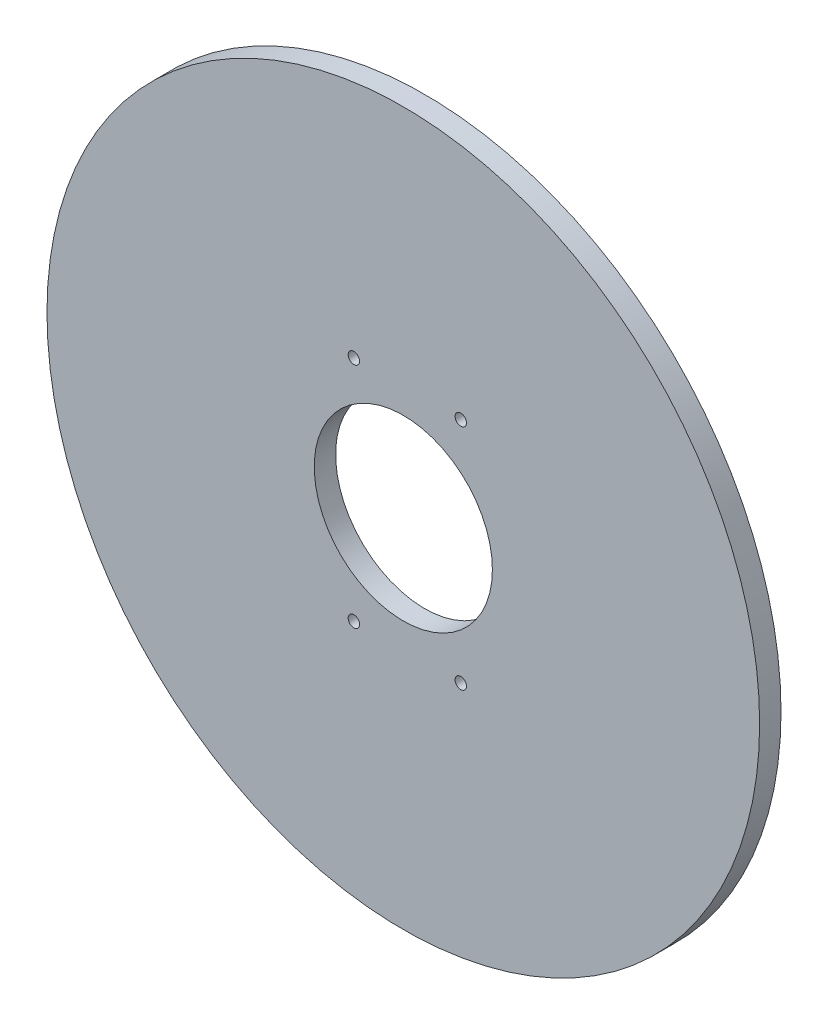
ISO-10303-21;
HEADER;
FILE_DESCRIPTION(('STEP AP214'),'2;1');
FILE_NAME('part.step','',(''),(''),'','','');
FILE_SCHEMA(('AUTOMOTIVE_DESIGN { 1 0 10303 214 1 1 1 1 }'));
ENDSEC;
DATA;
#1=APPLICATION_CONTEXT('core data for automotive mechanical design processes');
#2=APPLICATION_PROTOCOL_DEFINITION('international standard','automotive_design',2000,#1);
#3=PRODUCT_CONTEXT('',#1,'mechanical');
#4=PRODUCT('Part','Part','',(#3));
#5=PRODUCT_RELATED_PRODUCT_CATEGORY('part','',(#4));
#6=PRODUCT_DEFINITION_FORMATION('','',#4);
#7=PRODUCT_DEFINITION_CONTEXT('part definition',#1,'design');
#8=PRODUCT_DEFINITION('design','',#6,#7);
#9=PRODUCT_DEFINITION_SHAPE('','',#8);
#10=(LENGTH_UNIT() NAMED_UNIT(*) SI_UNIT(.MILLI.,.METRE.));
#11=(NAMED_UNIT(*) PLANE_ANGLE_UNIT() SI_UNIT($,.RADIAN.));
#12=(NAMED_UNIT(*) SI_UNIT($,.STERADIAN.) SOLID_ANGLE_UNIT());
#13=UNCERTAINTY_MEASURE_WITH_UNIT(LENGTH_MEASURE(1.E-05),#10,'distance_accuracy_value','');
#14=(GEOMETRIC_REPRESENTATION_CONTEXT(3) GLOBAL_UNCERTAINTY_ASSIGNED_CONTEXT((#13)) GLOBAL_UNIT_ASSIGNED_CONTEXT((#10,
#11,#12)) REPRESENTATION_CONTEXT('',''));
#15=CARTESIAN_POINT('',(0.,0.,0.));
#16=DIRECTION('',(0.,0.,1.));
#17=DIRECTION('',(1.,0.,0.));
#18=AXIS2_PLACEMENT_3D('',#15,#16,#17);
#19=CARTESIAN_POINT('',(0.,0.,6.));
#20=DIRECTION('',(0.,0.,1.));
#21=DIRECTION('',(1.,0.,0.));
#22=AXIS2_PLACEMENT_3D('',#19,#20,#21);
#23=PLANE('',#22);
#24=CARTESIAN_POINT('',(16.1297094664268,-32.,6.));
#25=DIRECTION('',(0.,0.,-1.));
#26=DIRECTION('',(1.,0.,0.));
#27=AXIS2_PLACEMENT_3D('',#24,#25,#26);
#28=CIRCLE('',#27,1.6);
#29=CARTESIAN_POINT('',(17.7297094664268,-32.,6.));
#30=VERTEX_POINT('',#29);
#31=EDGE_CURVE('E65',#30,#30,#28,.T.);
#32=ORIENTED_EDGE('',*,*,#31,.T.);
#33=EDGE_LOOP('',(#32));
#34=FACE_BOUND('',#33,.T.);
#35=CARTESIAN_POINT('',(-13.8702905335732,-32.,6.));
#36=DIRECTION('',(0.,0.,-1.));
#37=DIRECTION('',(1.,0.,0.));
#38=AXIS2_PLACEMENT_3D('',#35,#36,#37);
#39=CIRCLE('',#38,1.6);
#40=CARTESIAN_POINT('',(-12.2702905335732,-32.,6.));
#41=VERTEX_POINT('',#40);
#42=EDGE_CURVE('E59',#41,#41,#39,.T.);
#43=ORIENTED_EDGE('',*,*,#42,.T.);
#44=EDGE_LOOP('',(#43));
#45=FACE_BOUND('',#44,.T.);
#46=CARTESIAN_POINT('',(-13.8702905335732,32.,6.));
#47=DIRECTION('',(0.,0.,-1.));
#48=DIRECTION('',(-1.,0.,0.));
#49=AXIS2_PLACEMENT_3D('',#46,#47,#48);
#50=CIRCLE('',#49,1.6);
#51=CARTESIAN_POINT('',(-15.4702905335732,32.,6.));
#52=VERTEX_POINT('',#51);
#53=EDGE_CURVE('E53',#52,#52,#50,.T.);
#54=ORIENTED_EDGE('',*,*,#53,.T.);
#55=EDGE_LOOP('',(#54));
#56=FACE_BOUND('',#55,.T.);
#57=CARTESIAN_POINT('',(16.1297094664268,32.,6.));
#58=DIRECTION('',(0.,0.,-1.));
#59=DIRECTION('',(-1.,0.,0.));
#60=AXIS2_PLACEMENT_3D('',#57,#58,#59);
#61=CIRCLE('',#60,1.6);
#62=CARTESIAN_POINT('',(14.5297094664268,32.,6.));
#63=VERTEX_POINT('',#62);
#64=EDGE_CURVE('E47',#63,#63,#61,.T.);
#65=ORIENTED_EDGE('',*,*,#64,.T.);
#66=EDGE_LOOP('',(#65));
#67=FACE_BOUND('',#66,.T.);
#68=CARTESIAN_POINT('',(0.,0.,6.));
#69=DIRECTION('',(0.,0.,1.));
#70=DIRECTION('',(1.,0.,0.));
#71=AXIS2_PLACEMENT_3D('',#68,#69,#70);
#72=CIRCLE('',#71,100.);
#73=CARTESIAN_POINT('',(100.,0.,6.));
#74=VERTEX_POINT('',#73);
#75=EDGE_CURVE('E10',#74,#74,#72,.T.);
#76=ORIENTED_EDGE('',*,*,#75,.T.);
#77=EDGE_LOOP('',(#76));
#78=FACE_BOUND('',#77,.T.);
#79=CARTESIAN_POINT('',(0.,0.,6.));
#80=DIRECTION('',(0.,0.,1.));
#81=DIRECTION('',(1.,0.,0.));
#82=AXIS2_PLACEMENT_3D('',#79,#80,#81);
#83=CIRCLE('',#82,25.);
#84=CARTESIAN_POINT('',(25.,0.,6.));
#85=VERTEX_POINT('',#84);
#86=EDGE_CURVE('E42',#85,#85,#83,.T.);
#87=ORIENTED_EDGE('',*,*,#86,.F.);
#88=EDGE_LOOP('',(#87));
#89=FACE_BOUND('',#88,.T.);
#90=ADVANCED_FACE('F31',(#34,#45,#56,#67,#78,#89),#23,.T.);
#91=CARTESIAN_POINT('',(0.,0.,0.));
#92=DIRECTION('',(0.,0.,1.));
#93=DIRECTION('',(1.,0.,0.));
#94=AXIS2_PLACEMENT_3D('',#91,#92,#93);
#95=PLANE('',#94);
#96=CARTESIAN_POINT('',(16.1297094664268,-32.,0.));
#97=DIRECTION('',(0.,0.,-1.));
#98=DIRECTION('',(1.,0.,0.));
#99=AXIS2_PLACEMENT_3D('',#96,#97,#98);
#100=CIRCLE('',#99,1.6);
#101=CARTESIAN_POINT('',(17.7297094664268,-32.,0.));
#102=VERTEX_POINT('',#101);
#103=EDGE_CURVE('E68',#102,#102,#100,.T.);
#104=ORIENTED_EDGE('',*,*,#103,.F.);
#105=EDGE_LOOP('',(#104));
#106=FACE_BOUND('',#105,.T.);
#107=CARTESIAN_POINT('',(-13.8702905335732,-32.,0.));
#108=DIRECTION('',(0.,0.,-1.));
#109=DIRECTION('',(1.,0.,0.));
#110=AXIS2_PLACEMENT_3D('',#107,#108,#109);
#111=CIRCLE('',#110,1.6);
#112=CARTESIAN_POINT('',(-12.2702905335732,-32.,0.));
#113=VERTEX_POINT('',#112);
#114=EDGE_CURVE('E62',#113,#113,#111,.T.);
#115=ORIENTED_EDGE('',*,*,#114,.F.);
#116=EDGE_LOOP('',(#115));
#117=FACE_BOUND('',#116,.T.);
#118=CARTESIAN_POINT('',(-13.8702905335732,32.,0.));
#119=DIRECTION('',(0.,0.,-1.));
#120=DIRECTION('',(-1.,0.,0.));
#121=AXIS2_PLACEMENT_3D('',#118,#119,#120);
#122=CIRCLE('',#121,1.6);
#123=CARTESIAN_POINT('',(-15.4702905335732,32.,0.));
#124=VERTEX_POINT('',#123);
#125=EDGE_CURVE('E56',#124,#124,#122,.T.);
#126=ORIENTED_EDGE('',*,*,#125,.F.);
#127=EDGE_LOOP('',(#126));
#128=FACE_BOUND('',#127,.T.);
#129=CARTESIAN_POINT('',(16.1297094664268,32.,0.));
#130=DIRECTION('',(0.,0.,-1.));
#131=DIRECTION('',(-1.,0.,0.));
#132=AXIS2_PLACEMENT_3D('',#129,#130,#131);
#133=CIRCLE('',#132,1.6);
#134=CARTESIAN_POINT('',(14.5297094664268,32.,0.));
#135=VERTEX_POINT('',#134);
#136=EDGE_CURVE('E50',#135,#135,#133,.T.);
#137=ORIENTED_EDGE('',*,*,#136,.F.);
#138=EDGE_LOOP('',(#137));
#139=FACE_BOUND('',#138,.T.);
#140=CARTESIAN_POINT('',(0.,0.,0.));
#141=DIRECTION('',(0.,0.,1.));
#142=DIRECTION('',(1.,0.,0.));
#143=AXIS2_PLACEMENT_3D('',#140,#141,#142);
#144=CIRCLE('',#143,100.);
#145=CARTESIAN_POINT('',(100.,0.,0.));
#146=VERTEX_POINT('',#145);
#147=EDGE_CURVE('E35',#146,#146,#144,.T.);
#148=ORIENTED_EDGE('',*,*,#147,.F.);
#149=EDGE_LOOP('',(#148));
#150=FACE_BOUND('',#149,.T.);
#151=CARTESIAN_POINT('',(0.,0.,0.));
#152=DIRECTION('',(0.,0.,1.));
#153=DIRECTION('',(1.,0.,0.));
#154=AXIS2_PLACEMENT_3D('',#151,#152,#153);
#155=CIRCLE('',#154,25.);
#156=CARTESIAN_POINT('',(25.,0.,0.));
#157=VERTEX_POINT('',#156);
#158=EDGE_CURVE('E44',#157,#157,#155,.T.);
#159=ORIENTED_EDGE('',*,*,#158,.T.);
#160=EDGE_LOOP('',(#159));
#161=FACE_BOUND('',#160,.T.);
#162=ADVANCED_FACE('F83',(#106,#117,#128,#139,#150,#161),#95,.F.);
#163=CARTESIAN_POINT('',(0.,0.,6.));
#164=DIRECTION('',(0.,0.,-1.));
#165=DIRECTION('',(-1.,0.,0.));
#166=AXIS2_PLACEMENT_3D('',#163,#164,#165);
#167=CYLINDRICAL_SURFACE('',#166,100.);
#168=ORIENTED_EDGE('',*,*,#75,.F.);
#169=EDGE_LOOP('',(#168));
#170=FACE_BOUND('',#169,.T.);
#171=ORIENTED_EDGE('',*,*,#147,.T.);
#172=EDGE_LOOP('',(#171));
#173=FACE_BOUND('',#172,.T.);
#174=ADVANCED_FACE('F33',(#170,#173),#167,.T.);
#175=CARTESIAN_POINT('',(0.,0.,6.));
#176=DIRECTION('',(0.,0.,-1.));
#177=DIRECTION('',(-1.,0.,0.));
#178=AXIS2_PLACEMENT_3D('',#175,#176,#177);
#179=CYLINDRICAL_SURFACE('',#178,25.);
#180=ORIENTED_EDGE('',*,*,#86,.T.);
#181=EDGE_LOOP('',(#180));
#182=FACE_BOUND('',#181,.T.);
#183=ORIENTED_EDGE('',*,*,#158,.F.);
#184=EDGE_LOOP('',(#183));
#185=FACE_BOUND('',#184,.T.);
#186=ADVANCED_FACE('F96',(#182,#185),#179,.F.);
#187=CARTESIAN_POINT('',(16.1297094664268,32.,6.));
#188=DIRECTION('',(0.,0.,-1.));
#189=DIRECTION('',(-1.,0.,0.));
#190=AXIS2_PLACEMENT_3D('',#187,#188,#189);
#191=CYLINDRICAL_SURFACE('',#190,1.6);
#192=ORIENTED_EDGE('',*,*,#64,.F.);
#193=EDGE_LOOP('',(#192));
#194=FACE_BOUND('',#193,.T.);
#195=ORIENTED_EDGE('',*,*,#136,.T.);
#196=EDGE_LOOP('',(#195));
#197=FACE_BOUND('',#196,.T.);
#198=ADVANCED_FACE('F98',(#194,#197),#191,.F.);
#199=CARTESIAN_POINT('',(-13.8702905335732,32.,6.));
#200=DIRECTION('',(0.,0.,-1.));
#201=DIRECTION('',(-1.,0.,0.));
#202=AXIS2_PLACEMENT_3D('',#199,#200,#201);
#203=CYLINDRICAL_SURFACE('',#202,1.6);
#204=ORIENTED_EDGE('',*,*,#53,.F.);
#205=EDGE_LOOP('',(#204));
#206=FACE_BOUND('',#205,.T.);
#207=ORIENTED_EDGE('',*,*,#125,.T.);
#208=EDGE_LOOP('',(#207));
#209=FACE_BOUND('',#208,.T.);
#210=ADVANCED_FACE('F105',(#206,#209),#203,.F.);
#211=CARTESIAN_POINT('',(-13.8702905335732,-32.,6.));
#212=DIRECTION('',(0.,0.,-1.));
#213=DIRECTION('',(-1.,0.,0.));
#214=AXIS2_PLACEMENT_3D('',#211,#212,#213);
#215=CYLINDRICAL_SURFACE('',#214,1.6);
#216=ORIENTED_EDGE('',*,*,#42,.F.);
#217=EDGE_LOOP('',(#216));
#218=FACE_BOUND('',#217,.T.);
#219=ORIENTED_EDGE('',*,*,#114,.T.);
#220=EDGE_LOOP('',(#219));
#221=FACE_BOUND('',#220,.T.);
#222=ADVANCED_FACE('F79',(#218,#221),#215,.F.);
#223=CARTESIAN_POINT('',(16.1297094664268,-32.,6.));
#224=DIRECTION('',(0.,0.,-1.));
#225=DIRECTION('',(-1.,0.,0.));
#226=AXIS2_PLACEMENT_3D('',#223,#224,#225);
#227=CYLINDRICAL_SURFACE('',#226,1.6);
#228=ORIENTED_EDGE('',*,*,#31,.F.);
#229=EDGE_LOOP('',(#228));
#230=FACE_BOUND('',#229,.T.);
#231=ORIENTED_EDGE('',*,*,#103,.T.);
#232=EDGE_LOOP('',(#231));
#233=FACE_BOUND('',#232,.T.);
#234=ADVANCED_FACE('F76',(#230,#233),#227,.F.);
#235=CLOSED_SHELL('',(#90,#162,#174,#186,#198,#210,#222,#234));
#236=MANIFOLD_SOLID_BREP('B2',#235);
#237=ADVANCED_BREP_SHAPE_REPRESENTATION('',(#18,#236),#14);
#238=SHAPE_DEFINITION_REPRESENTATION(#9,#237);
ENDSEC;
END-ISO-10303-21;
